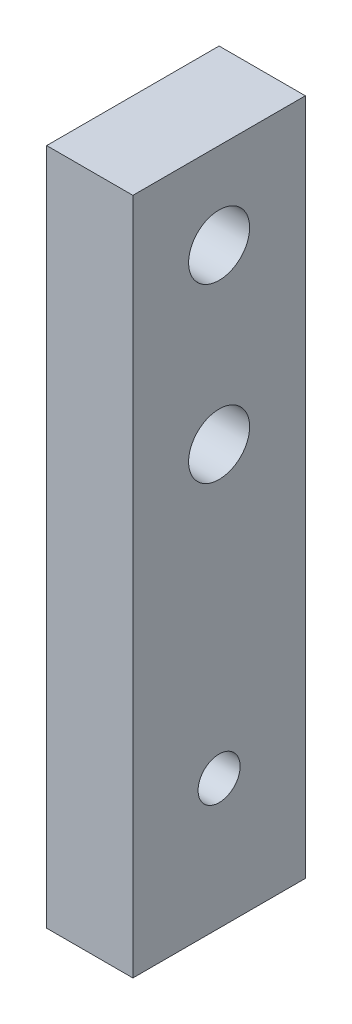
ISO-10303-21;
HEADER;
FILE_DESCRIPTION(('STEP AP214'),'2;1');
FILE_NAME('part.step','',(''),(''),'','','');
FILE_SCHEMA(('AUTOMOTIVE_DESIGN { 1 0 10303 214 1 1 1 1 }'));
ENDSEC;
DATA;
#1=APPLICATION_CONTEXT('core data for automotive mechanical design processes');
#2=APPLICATION_PROTOCOL_DEFINITION('international standard','automotive_design',2000,#1);
#3=PRODUCT_CONTEXT('',#1,'mechanical');
#4=PRODUCT('Part','Part','',(#3));
#5=PRODUCT_RELATED_PRODUCT_CATEGORY('part','',(#4));
#6=PRODUCT_DEFINITION_FORMATION('','',#4);
#7=PRODUCT_DEFINITION_CONTEXT('part definition',#1,'design');
#8=PRODUCT_DEFINITION('design','',#6,#7);
#9=PRODUCT_DEFINITION_SHAPE('','',#8);
#10=(LENGTH_UNIT() NAMED_UNIT(*) SI_UNIT(.MILLI.,.METRE.));
#11=(NAMED_UNIT(*) PLANE_ANGLE_UNIT() SI_UNIT($,.RADIAN.));
#12=(NAMED_UNIT(*) SI_UNIT($,.STERADIAN.) SOLID_ANGLE_UNIT());
#13=UNCERTAINTY_MEASURE_WITH_UNIT(LENGTH_MEASURE(1.E-05),#10,'distance_accuracy_value','');
#14=(GEOMETRIC_REPRESENTATION_CONTEXT(3) GLOBAL_UNCERTAINTY_ASSIGNED_CONTEXT((#13)) GLOBAL_UNIT_ASSIGNED_CONTEXT((#10,
#11,#12)) REPRESENTATION_CONTEXT('',''));
#15=CARTESIAN_POINT('',(0.,0.,0.));
#16=DIRECTION('',(0.,0.,1.));
#17=DIRECTION('',(1.,0.,0.));
#18=AXIS2_PLACEMENT_3D('',#15,#16,#17);
#19=CARTESIAN_POINT('',(40.64,-24.530132824,10.475));
#20=DIRECTION('',(-1.,0.,0.));
#21=DIRECTION('',(0.,0.,1.));
#22=AXIS2_PLACEMENT_3D('',#19,#20,#21);
#23=PLANE('',#22);
#24=CARTESIAN_POINT('',(40.64,6.35,16.825));
#25=DIRECTION('',(-1.,0.,0.));
#26=DIRECTION('',(0.,0.,1.));
#27=AXIS2_PLACEMENT_3D('',#24,#25,#26);
#28=CIRCLE('',#27,2.2479);
#29=CARTESIAN_POINT('',(40.64,6.35,19.0729));
#30=VERTEX_POINT('',#29);
#31=EDGE_CURVE('E202',#30,#30,#28,.T.);
#32=ORIENTED_EDGE('',*,*,#31,.F.);
#33=EDGE_LOOP('',(#32));
#34=FACE_BOUND('',#33,.T.);
#35=CARTESIAN_POINT('',(40.64,19.05,16.825));
#36=DIRECTION('',(-1.,0.,0.));
#37=DIRECTION('',(0.,0.,1.));
#38=AXIS2_PLACEMENT_3D('',#35,#36,#37);
#39=CIRCLE('',#38,2.2479);
#40=CARTESIAN_POINT('',(40.64,19.05,19.0729));
#41=VERTEX_POINT('',#40);
#42=EDGE_CURVE('E101',#41,#41,#39,.T.);
#43=ORIENTED_EDGE('',*,*,#42,.F.);
#44=EDGE_LOOP('',(#43));
#45=FACE_BOUND('',#44,.T.);
#46=DIRECTION('',(0.,-1.,0.));
#47=VECTOR('',#46,1.);
#48=CARTESIAN_POINT('',(40.64,-24.520132824,23.175));
#49=LINE('',#48,#47);
#50=CARTESIAN_POINT('',(40.64,25.4,23.175));
#51=VERTEX_POINT('',#50);
#52=CARTESIAN_POINT('',(40.64,-24.520132824,23.175));
#53=VERTEX_POINT('',#52);
#54=EDGE_CURVE('E92',#51,#53,#49,.T.);
#55=ORIENTED_EDGE('',*,*,#54,.F.);
#56=DIRECTION('',(0.,0.,-1.));
#57=VECTOR('',#56,1.);
#58=CARTESIAN_POINT('',(40.64,25.4,0.));
#59=LINE('',#58,#57);
#60=CARTESIAN_POINT('',(40.64,25.4,10.475));
#61=VERTEX_POINT('',#60);
#62=EDGE_CURVE('E111',#51,#61,#59,.T.);
#63=ORIENTED_EDGE('',*,*,#62,.T.);
#64=DIRECTION('',(0.,1.,0.));
#65=VECTOR('',#64,1.);
#66=CARTESIAN_POINT('',(40.64,25.4,10.475));
#67=LINE('',#66,#65);
#68=CARTESIAN_POINT('',(40.64,-24.520132824,10.475));
#69=VERTEX_POINT('',#68);
#70=EDGE_CURVE('E54',#69,#61,#67,.T.);
#71=ORIENTED_EDGE('',*,*,#70,.F.);
#72=DIRECTION('',(0.,0.,-1.));
#73=VECTOR('',#72,1.);
#74=CARTESIAN_POINT('',(40.64,-24.520132824,10.475));
#75=LINE('',#74,#73);
#76=EDGE_CURVE('E95',#53,#69,#75,.T.);
#77=ORIENTED_EDGE('',*,*,#76,.F.);
#78=EDGE_LOOP('',(#55,#63,#71,#77));
#79=FACE_BOUND('',#78,.T.);
#80=CARTESIAN_POINT('',(40.64,-14.96,16.825));
#81=DIRECTION('',(1.,0.,0.));
#82=DIRECTION('',(0.,0.,-1.));
#83=AXIS2_PLACEMENT_3D('',#80,#81,#82);
#84=CIRCLE('',#83,1.55);
#85=CARTESIAN_POINT('',(40.64,-14.96,15.275));
#86=VERTEX_POINT('',#85);
#87=EDGE_CURVE('E11',#86,#86,#84,.T.);
#88=ORIENTED_EDGE('',*,*,#87,.T.);
#89=EDGE_LOOP('',(#88));
#90=FACE_BOUND('',#89,.T.);
#91=ADVANCED_FACE('F35',(#34,#45,#79,#90),#23,.T.);
#92=CARTESIAN_POINT('',(0.,25.4,0.));
#93=DIRECTION('',(0.,-1.,0.));
#94=DIRECTION('',(0.,0.,-1.));
#95=AXIS2_PLACEMENT_3D('',#92,#93,#94);
#96=PLANE('',#95);
#97=ORIENTED_EDGE('',*,*,#62,.F.);
#98=DIRECTION('',(-1.,0.,0.));
#99=VECTOR('',#98,1.);
#100=CARTESIAN_POINT('',(40.64,25.4,23.175));
#101=LINE('',#100,#99);
#102=CARTESIAN_POINT('',(46.99,25.4,23.175));
#103=VERTEX_POINT('',#102);
#104=EDGE_CURVE('E99',#103,#51,#101,.T.);
#105=ORIENTED_EDGE('',*,*,#104,.F.);
#106=DIRECTION('',(0.,0.,1.));
#107=VECTOR('',#106,1.);
#108=CARTESIAN_POINT('',(46.99,25.4,23.175));
#109=LINE('',#108,#107);
#110=CARTESIAN_POINT('',(46.99,25.4,10.475));
#111=VERTEX_POINT('',#110);
#112=EDGE_CURVE('E82',#111,#103,#109,.T.);
#113=ORIENTED_EDGE('',*,*,#112,.F.);
#114=DIRECTION('',(-1.,0.,0.));
#115=VECTOR('',#114,1.);
#116=CARTESIAN_POINT('',(40.64,25.4,10.475));
#117=LINE('',#116,#115);
#118=EDGE_CURVE('E39',#111,#61,#117,.T.);
#119=ORIENTED_EDGE('',*,*,#118,.T.);
#120=EDGE_LOOP('',(#97,#105,#113,#119));
#121=FACE_BOUND('',#120,.T.);
#122=ADVANCED_FACE('F119',(#121),#96,.F.);
#123=CARTESIAN_POINT('',(40.64,25.4,23.175));
#124=DIRECTION('',(0.,0.,1.));
#125=DIRECTION('',(1.,0.,0.));
#126=AXIS2_PLACEMENT_3D('',#123,#124,#125);
#127=PLANE('',#126);
#128=ORIENTED_EDGE('',*,*,#104,.T.);
#129=ORIENTED_EDGE('',*,*,#54,.T.);
#130=DIRECTION('',(-1.,0.,0.));
#131=VECTOR('',#130,1.);
#132=CARTESIAN_POINT('',(46.99,-24.520132824,23.175));
#133=LINE('',#132,#131);
#134=CARTESIAN_POINT('',(46.99,-24.520132824,23.175));
#135=VERTEX_POINT('',#134);
#136=EDGE_CURVE('E96',#135,#53,#133,.T.);
#137=ORIENTED_EDGE('',*,*,#136,.F.);
#138=DIRECTION('',(0.,-1.,0.));
#139=VECTOR('',#138,1.);
#140=CARTESIAN_POINT('',(46.99,-24.520132824,23.175));
#141=LINE('',#140,#139);
#142=EDGE_CURVE('E88',#103,#135,#141,.T.);
#143=ORIENTED_EDGE('',*,*,#142,.F.);
#144=EDGE_LOOP('',(#128,#129,#137,#143));
#145=FACE_BOUND('',#144,.T.);
#146=ADVANCED_FACE('F37',(#145),#127,.T.);
#147=CARTESIAN_POINT('',(46.99,0.,0.));
#148=DIRECTION('',(-1.,0.,0.));
#149=DIRECTION('',(0.,0.,1.));
#150=AXIS2_PLACEMENT_3D('',#147,#148,#149);
#151=PLANE('',#150);
#152=CARTESIAN_POINT('',(46.99,6.35,16.825));
#153=DIRECTION('',(-1.,0.,0.));
#154=DIRECTION('',(0.,0.,1.));
#155=AXIS2_PLACEMENT_3D('',#152,#153,#154);
#156=CIRCLE('',#155,2.2479);
#157=CARTESIAN_POINT('',(46.99,6.35,19.0729));
#158=VERTEX_POINT('',#157);
#159=EDGE_CURVE('E199',#158,#158,#156,.T.);
#160=ORIENTED_EDGE('',*,*,#159,.T.);
#161=EDGE_LOOP('',(#160));
#162=FACE_BOUND('',#161,.T.);
#163=CARTESIAN_POINT('',(46.99,19.05,16.825));
#164=DIRECTION('',(-1.,0.,0.));
#165=DIRECTION('',(0.,0.,1.));
#166=AXIS2_PLACEMENT_3D('',#163,#164,#165);
#167=CIRCLE('',#166,2.2479);
#168=CARTESIAN_POINT('',(46.99,19.05,19.0729));
#169=VERTEX_POINT('',#168);
#170=EDGE_CURVE('E203',#169,#169,#167,.T.);
#171=ORIENTED_EDGE('',*,*,#170,.T.);
#172=EDGE_LOOP('',(#171));
#173=FACE_BOUND('',#172,.T.);
#174=DIRECTION('',(0.,0.,-1.));
#175=VECTOR('',#174,1.);
#176=CARTESIAN_POINT('',(46.99,-24.520132824,10.475));
#177=LINE('',#176,#175);
#178=CARTESIAN_POINT('',(46.99,-24.520132824,10.475));
#179=VERTEX_POINT('',#178);
#180=EDGE_CURVE('E81',#135,#179,#177,.T.);
#181=ORIENTED_EDGE('',*,*,#180,.T.);
#182=DIRECTION('',(0.,1.,0.));
#183=VECTOR('',#182,1.);
#184=CARTESIAN_POINT('',(46.99,25.4,10.475));
#185=LINE('',#184,#183);
#186=EDGE_CURVE('E72',#179,#111,#185,.T.);
#187=ORIENTED_EDGE('',*,*,#186,.T.);
#188=ORIENTED_EDGE('',*,*,#112,.T.);
#189=ORIENTED_EDGE('',*,*,#142,.T.);
#190=EDGE_LOOP('',(#181,#187,#188,#189));
#191=FACE_BOUND('',#190,.T.);
#192=CARTESIAN_POINT('',(46.99,-14.96,16.825));
#193=DIRECTION('',(1.,0.,0.));
#194=DIRECTION('',(0.,0.,-1.));
#195=AXIS2_PLACEMENT_3D('',#192,#193,#194);
#196=CIRCLE('',#195,1.55);
#197=CARTESIAN_POINT('',(46.99,-14.96,15.275));
#198=VERTEX_POINT('',#197);
#199=EDGE_CURVE('E45',#198,#198,#196,.T.);
#200=ORIENTED_EDGE('',*,*,#199,.F.);
#201=EDGE_LOOP('',(#200));
#202=FACE_BOUND('',#201,.T.);
#203=ADVANCED_FACE('F85',(#162,#173,#191,#202),#151,.F.);
#204=CARTESIAN_POINT('',(46.99,-14.96,16.825));
#205=DIRECTION('',(-1.,0.,0.));
#206=DIRECTION('',(0.,0.,1.));
#207=AXIS2_PLACEMENT_3D('',#204,#205,#206);
#208=CYLINDRICAL_SURFACE('',#207,1.55);
#209=ORIENTED_EDGE('',*,*,#199,.T.);
#210=EDGE_LOOP('',(#209));
#211=FACE_BOUND('',#210,.T.);
#212=ORIENTED_EDGE('',*,*,#87,.F.);
#213=EDGE_LOOP('',(#212));
#214=FACE_BOUND('',#213,.T.);
#215=ADVANCED_FACE('F127',(#211,#214),#208,.F.);
#216=CARTESIAN_POINT('',(40.64,25.4,10.475));
#217=DIRECTION('',(0.,0.,-1.));
#218=DIRECTION('',(0.,1.,0.));
#219=AXIS2_PLACEMENT_3D('',#216,#217,#218);
#220=PLANE('',#219);
#221=ORIENTED_EDGE('',*,*,#70,.T.);
#222=ORIENTED_EDGE('',*,*,#118,.F.);
#223=ORIENTED_EDGE('',*,*,#186,.F.);
#224=DIRECTION('',(-1.,0.,0.));
#225=VECTOR('',#224,1.);
#226=CARTESIAN_POINT('',(46.99,-24.520132824,10.475));
#227=LINE('',#226,#225);
#228=EDGE_CURVE('E76',#179,#69,#227,.T.);
#229=ORIENTED_EDGE('',*,*,#228,.T.);
#230=EDGE_LOOP('',(#221,#222,#223,#229));
#231=FACE_BOUND('',#230,.T.);
#232=ADVANCED_FACE('F74',(#231),#220,.T.);
#233=CARTESIAN_POINT('',(46.99,-24.520132824,10.475));
#234=DIRECTION('',(0.,1.,0.));
#235=DIRECTION('',(0.,0.,1.));
#236=AXIS2_PLACEMENT_3D('',#233,#234,#235);
#237=PLANE('',#236);
#238=ORIENTED_EDGE('',*,*,#76,.T.);
#239=ORIENTED_EDGE('',*,*,#228,.F.);
#240=ORIENTED_EDGE('',*,*,#180,.F.);
#241=ORIENTED_EDGE('',*,*,#136,.T.);
#242=EDGE_LOOP('',(#238,#239,#240,#241));
#243=FACE_BOUND('',#242,.T.);
#244=ADVANCED_FACE('F94',(#243),#237,.F.);
#245=CARTESIAN_POINT('',(-40.64,19.05,16.825));
#246=DIRECTION('',(1.,0.,0.));
#247=DIRECTION('',(0.,0.,1.));
#248=AXIS2_PLACEMENT_3D('',#245,#246,#247);
#249=CYLINDRICAL_SURFACE('',#248,2.2479);
#250=ORIENTED_EDGE('',*,*,#170,.F.);
#251=EDGE_LOOP('',(#250));
#252=FACE_BOUND('',#251,.T.);
#253=ORIENTED_EDGE('',*,*,#42,.T.);
#254=EDGE_LOOP('',(#253));
#255=FACE_BOUND('',#254,.T.);
#256=ADVANCED_FACE('F124',(#252,#255),#249,.F.);
#257=CARTESIAN_POINT('',(-40.64,6.35,16.825));
#258=DIRECTION('',(1.,0.,0.));
#259=DIRECTION('',(0.,0.,1.));
#260=AXIS2_PLACEMENT_3D('',#257,#258,#259);
#261=CYLINDRICAL_SURFACE('',#260,2.2479);
#262=ORIENTED_EDGE('',*,*,#159,.F.);
#263=EDGE_LOOP('',(#262));
#264=FACE_BOUND('',#263,.T.);
#265=ORIENTED_EDGE('',*,*,#31,.T.);
#266=EDGE_LOOP('',(#265));
#267=FACE_BOUND('',#266,.T.);
#268=ADVANCED_FACE('F183',(#264,#267),#261,.F.);
#269=CLOSED_SHELL('',(#91,#122,#146,#203,#215,#232,#244,#256,#268));
#270=MANIFOLD_SOLID_BREP('B2',#269);
#271=ADVANCED_BREP_SHAPE_REPRESENTATION('',(#18,#270),#14);
#272=SHAPE_DEFINITION_REPRESENTATION(#9,#271);
ENDSEC;
END-ISO-10303-21;
